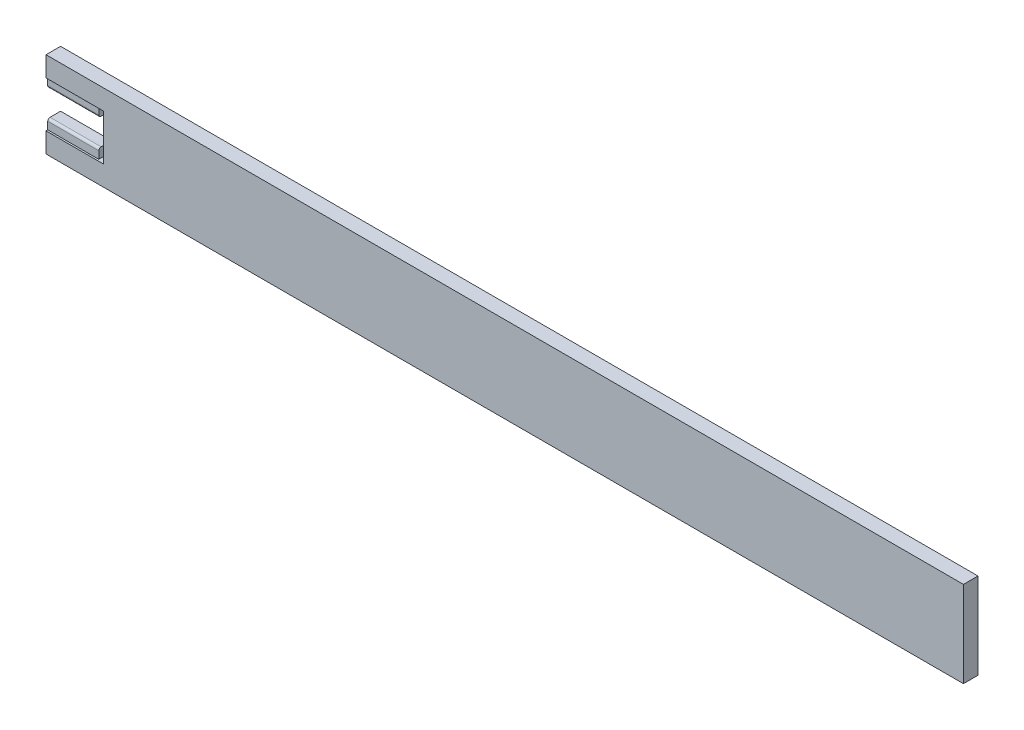
ISO-10303-21;
HEADER;
FILE_DESCRIPTION(('STEP AP214'),'2;1');
FILE_NAME('part.step','',(''),(''),'','','');
FILE_SCHEMA(('AUTOMOTIVE_DESIGN { 1 0 10303 214 1 1 1 1 }'));
ENDSEC;
DATA;
#1=APPLICATION_CONTEXT('core data for automotive mechanical design processes');
#2=APPLICATION_PROTOCOL_DEFINITION('international standard','automotive_design',2000,#1);
#3=PRODUCT_CONTEXT('',#1,'mechanical');
#4=PRODUCT('Part','Part','',(#3));
#5=PRODUCT_RELATED_PRODUCT_CATEGORY('part','',(#4));
#6=PRODUCT_DEFINITION_FORMATION('','',#4);
#7=PRODUCT_DEFINITION_CONTEXT('part definition',#1,'design');
#8=PRODUCT_DEFINITION('design','',#6,#7);
#9=PRODUCT_DEFINITION_SHAPE('','',#8);
#10=(LENGTH_UNIT() NAMED_UNIT(*) SI_UNIT(.MILLI.,.METRE.));
#11=(NAMED_UNIT(*) PLANE_ANGLE_UNIT() SI_UNIT($,.RADIAN.));
#12=(NAMED_UNIT(*) SI_UNIT($,.STERADIAN.) SOLID_ANGLE_UNIT());
#13=UNCERTAINTY_MEASURE_WITH_UNIT(LENGTH_MEASURE(1.E-05),#10,'distance_accuracy_value','');
#14=(GEOMETRIC_REPRESENTATION_CONTEXT(3) GLOBAL_UNCERTAINTY_ASSIGNED_CONTEXT((#13)) GLOBAL_UNIT_ASSIGNED_CONTEXT((#10,
#11,#12)) REPRESENTATION_CONTEXT('',''));
#15=CARTESIAN_POINT('',(0.,0.,0.));
#16=DIRECTION('',(0.,0.,1.));
#17=DIRECTION('',(1.,0.,0.));
#18=AXIS2_PLACEMENT_3D('',#15,#16,#17);
#19=CARTESIAN_POINT('',(0.,98.,0.));
#20=DIRECTION('',(0.,1.,0.));
#21=DIRECTION('',(-1.,0.,0.));
#22=AXIS2_PLACEMENT_3D('',#19,#20,#21);
#23=PLANE('',#22);
#24=DIRECTION('',(0.,0.,1.));
#25=VECTOR('',#24,1.);
#26=CARTESIAN_POINT('',(89.,98.,0.));
#27=LINE('',#26,#25);
#28=CARTESIAN_POINT('',(89.,98.,0.));
#29=VERTEX_POINT('',#28);
#30=CARTESIAN_POINT('',(89.,98.,18.4));
#31=VERTEX_POINT('',#30);
#32=EDGE_CURVE('E239',#29,#31,#27,.T.);
#33=ORIENTED_EDGE('',*,*,#32,.T.);
#34=DIRECTION('',(1.,0.,0.));
#35=VECTOR('',#34,1.);
#36=CARTESIAN_POINT('',(0.,98.,18.4));
#37=LINE('',#36,#35);
#38=CARTESIAN_POINT('',(0.,98.,18.4));
#39=VERTEX_POINT('',#38);
#40=EDGE_CURVE('E50',#31,#39,#37,.F.);
#41=ORIENTED_EDGE('',*,*,#40,.T.);
#42=DIRECTION('',(0.,0.,1.));
#43=VECTOR('',#42,1.);
#44=CARTESIAN_POINT('',(0.,98.,0.));
#45=LINE('',#44,#43);
#46=CARTESIAN_POINT('',(0.,98.,0.));
#47=VERTEX_POINT('',#46);
#48=EDGE_CURVE('E235',#47,#39,#45,.T.);
#49=ORIENTED_EDGE('',*,*,#48,.F.);
#50=DIRECTION('',(-1.,0.,0.));
#51=VECTOR('',#50,1.);
#52=CARTESIAN_POINT('',(0.,98.,0.));
#53=LINE('',#52,#51);
#54=EDGE_CURVE('E222',#29,#47,#53,.T.);
#55=ORIENTED_EDGE('',*,*,#54,.F.);
#56=EDGE_LOOP('',(#33,#41,#49,#55));
#57=FACE_BOUND('',#56,.T.);
#58=ADVANCED_FACE('F41',(#57),#23,.F.);
#59=CARTESIAN_POINT('',(89.,115.,0.));
#60=DIRECTION('',(-1.,0.,0.));
#61=DIRECTION('',(0.,0.,1.));
#62=AXIS2_PLACEMENT_3D('',#59,#60,#61);
#63=PLANE('',#62);
#64=DIRECTION('',(0.,1.,0.));
#65=VECTOR('',#64,1.);
#66=CARTESIAN_POINT('',(89.,115.,22.4));
#67=LINE('',#66,#65);
#68=CARTESIAN_POINT('',(89.,102.,22.4));
#69=VERTEX_POINT('',#68);
#70=CARTESIAN_POINT('',(89.,115.,22.4));
#71=VERTEX_POINT('',#70);
#72=EDGE_CURVE('E193',#69,#71,#67,.T.);
#73=ORIENTED_EDGE('',*,*,#72,.F.);
#74=CARTESIAN_POINT('',(89.,102.,18.4));
#75=DIRECTION('',(-1.,0.,0.));
#76=DIRECTION('',(0.,0.,1.));
#77=AXIS2_PLACEMENT_3D('',#74,#75,#76);
#78=CIRCLE('',#77,4.);
#79=EDGE_CURVE('E64',#69,#31,#78,.F.);
#80=ORIENTED_EDGE('',*,*,#79,.T.);
#81=ORIENTED_EDGE('',*,*,#32,.F.);
#82=DIRECTION('',(0.,-1.,0.));
#83=VECTOR('',#82,1.);
#84=CARTESIAN_POINT('',(89.,115.,0.));
#85=LINE('',#84,#83);
#86=CARTESIAN_POINT('',(89.,115.,0.));
#87=VERTEX_POINT('',#86);
#88=EDGE_CURVE('E218',#87,#29,#85,.T.);
#89=ORIENTED_EDGE('',*,*,#88,.F.);
#90=DIRECTION('',(0.,0.,1.));
#91=VECTOR('',#90,1.);
#92=CARTESIAN_POINT('',(89.,115.,0.));
#93=LINE('',#92,#91);
#94=EDGE_CURVE('E242',#87,#71,#93,.T.);
#95=ORIENTED_EDGE('',*,*,#94,.T.);
#96=EDGE_LOOP('',(#73,#80,#81,#89,#95));
#97=FACE_BOUND('',#96,.T.);
#98=ADVANCED_FACE('F363',(#97),#63,.F.);
#99=CARTESIAN_POINT('',(89.,52.,0.));
#100=DIRECTION('',(-1.,0.,0.));
#101=DIRECTION('',(0.,0.,1.));
#102=AXIS2_PLACEMENT_3D('',#99,#100,#101);
#103=PLANE('',#102);
#104=DIRECTION('',(0.,0.,1.));
#105=VECTOR('',#104,1.);
#106=CARTESIAN_POINT('',(89.,52.,0.));
#107=LINE('',#106,#105);
#108=CARTESIAN_POINT('',(89.,52.,0.));
#109=VERTEX_POINT('',#108);
#110=CARTESIAN_POINT('',(89.,52.,18.4));
#111=VERTEX_POINT('',#110);
#112=EDGE_CURVE('E254',#109,#111,#107,.T.);
#113=ORIENTED_EDGE('',*,*,#112,.T.);
#114=CARTESIAN_POINT('',(89.,48.,18.4));
#115=DIRECTION('',(-1.,0.,0.));
#116=DIRECTION('',(0.,0.,1.));
#117=AXIS2_PLACEMENT_3D('',#114,#115,#116);
#118=CIRCLE('',#117,4.);
#119=CARTESIAN_POINT('',(89.,48.,22.4));
#120=VERTEX_POINT('',#119);
#121=EDGE_CURVE('E311',#111,#120,#118,.F.);
#122=ORIENTED_EDGE('',*,*,#121,.T.);
#123=DIRECTION('',(0.,1.,0.));
#124=VECTOR('',#123,1.);
#125=CARTESIAN_POINT('',(89.,52.,22.4));
#126=LINE('',#125,#124);
#127=CARTESIAN_POINT('',(89.,35.,22.4));
#128=VERTEX_POINT('',#127);
#129=EDGE_CURVE('E187',#128,#120,#126,.T.);
#130=ORIENTED_EDGE('',*,*,#129,.F.);
#131=DIRECTION('',(0.,0.,1.));
#132=VECTOR('',#131,1.);
#133=CARTESIAN_POINT('',(89.,35.,0.));
#134=LINE('',#133,#132);
#135=CARTESIAN_POINT('',(89.,35.,0.));
#136=VERTEX_POINT('',#135);
#137=EDGE_CURVE('E174',#136,#128,#134,.T.);
#138=ORIENTED_EDGE('',*,*,#137,.F.);
#139=DIRECTION('',(0.,-1.,0.));
#140=VECTOR('',#139,1.);
#141=CARTESIAN_POINT('',(89.,52.,0.));
#142=LINE('',#141,#140);
#143=EDGE_CURVE('E201',#109,#136,#142,.T.);
#144=ORIENTED_EDGE('',*,*,#143,.F.);
#145=EDGE_LOOP('',(#113,#122,#130,#138,#144));
#146=FACE_BOUND('',#145,.T.);
#147=ADVANCED_FACE('F345',(#146),#103,.F.);
#148=CARTESIAN_POINT('',(0.,52.,0.));
#149=DIRECTION('',(0.,-1.,0.));
#150=DIRECTION('',(1.,0.,0.));
#151=AXIS2_PLACEMENT_3D('',#148,#149,#150);
#152=PLANE('',#151);
#153=DIRECTION('',(0.,0.,1.));
#154=VECTOR('',#153,1.);
#155=CARTESIAN_POINT('',(0.,52.,0.));
#156=LINE('',#155,#154);
#157=CARTESIAN_POINT('',(0.,52.,0.));
#158=VERTEX_POINT('',#157);
#159=CARTESIAN_POINT('',(0.,52.,18.4));
#160=VERTEX_POINT('',#159);
#161=EDGE_CURVE('E226',#158,#160,#156,.T.);
#162=ORIENTED_EDGE('',*,*,#161,.T.);
#163=DIRECTION('',(-1.,0.,0.));
#164=VECTOR('',#163,1.);
#165=CARTESIAN_POINT('',(89.,52.,18.4));
#166=LINE('',#165,#164);
#167=EDGE_CURVE('E308',#160,#111,#166,.F.);
#168=ORIENTED_EDGE('',*,*,#167,.T.);
#169=ORIENTED_EDGE('',*,*,#112,.F.);
#170=DIRECTION('',(1.,0.,0.));
#171=VECTOR('',#170,1.);
#172=CARTESIAN_POINT('',(0.,52.,0.));
#173=LINE('',#172,#171);
#174=EDGE_CURVE('E197',#158,#109,#173,.T.);
#175=ORIENTED_EDGE('',*,*,#174,.F.);
#176=EDGE_LOOP('',(#162,#168,#169,#175));
#177=FACE_BOUND('',#176,.T.);
#178=ADVANCED_FACE('F348',(#177),#152,.F.);
#179=CARTESIAN_POINT('',(0.,0.,25.4));
#180=DIRECTION('',(1.,0.,0.));
#181=DIRECTION('',(0.,0.,-1.));
#182=AXIS2_PLACEMENT_3D('',#179,#180,#181);
#183=PLANE('',#182);
#184=ORIENTED_EDGE('',*,*,#48,.T.);
#185=CARTESIAN_POINT('',(0.,102.,18.4));
#186=DIRECTION('',(1.,0.,0.));
#187=DIRECTION('',(0.,0.,-1.));
#188=AXIS2_PLACEMENT_3D('',#185,#186,#187);
#189=CIRCLE('',#188,4.);
#190=CARTESIAN_POINT('',(0.,102.,22.4));
#191=VERTEX_POINT('',#190);
#192=EDGE_CURVE('E11',#39,#191,#189,.F.);
#193=ORIENTED_EDGE('',*,*,#192,.T.);
#194=DIRECTION('',(0.,-1.,0.));
#195=VECTOR('',#194,1.);
#196=CARTESIAN_POINT('',(0.,115.,22.4));
#197=LINE('',#196,#195);
#198=CARTESIAN_POINT('',(0.,115.,22.4));
#199=VERTEX_POINT('',#198);
#200=EDGE_CURVE('E164',#199,#191,#197,.T.);
#201=ORIENTED_EDGE('',*,*,#200,.F.);
#202=DIRECTION('',(0.,0.,1.));
#203=VECTOR('',#202,1.);
#204=CARTESIAN_POINT('',(0.,115.,22.4));
#205=LINE('',#204,#203);
#206=CARTESIAN_POINT('',(0.,115.,25.4));
#207=VERTEX_POINT('',#206);
#208=EDGE_CURVE('E182',#199,#207,#205,.T.);
#209=ORIENTED_EDGE('',*,*,#208,.T.);
#210=DIRECTION('',(0.,-1.,0.));
#211=VECTOR('',#210,1.);
#212=CARTESIAN_POINT('',(0.,0.,25.4));
#213=LINE('',#212,#211);
#214=CARTESIAN_POINT('',(0.,150.,25.4));
#215=VERTEX_POINT('',#214);
#216=EDGE_CURVE('E261',#215,#207,#213,.T.);
#217=ORIENTED_EDGE('',*,*,#216,.F.);
#218=DIRECTION('',(0.,0.,-1.));
#219=VECTOR('',#218,1.);
#220=CARTESIAN_POINT('',(0.,150.,25.4));
#221=LINE('',#220,#219);
#222=CARTESIAN_POINT('',(0.,150.,0.));
#223=VERTEX_POINT('',#222);
#224=EDGE_CURVE('E274',#215,#223,#221,.T.);
#225=ORIENTED_EDGE('',*,*,#224,.T.);
#226=DIRECTION('',(0.,-1.,0.));
#227=VECTOR('',#226,1.);
#228=CARTESIAN_POINT('',(0.,0.,0.));
#229=LINE('',#228,#227);
#230=EDGE_CURVE('E275',#223,#47,#229,.T.);
#231=ORIENTED_EDGE('',*,*,#230,.T.);
#232=EDGE_LOOP('',(#184,#193,#201,#209,#217,#225,#231));
#233=FACE_BOUND('',#232,.T.);
#234=ADVANCED_FACE('F382',(#233),#183,.F.);
#235=CARTESIAN_POINT('',(0.,48.,22.4));
#236=VERTEX_POINT('',#235);
#237=CARTESIAN_POINT('',(0.,35.,22.4));
#238=VERTEX_POINT('',#237);
#239=EDGE_CURVE('E153',#236,#238,#197,.T.);
#240=ORIENTED_EDGE('',*,*,#239,.F.);
#241=CARTESIAN_POINT('',(0.,48.,18.4));
#242=DIRECTION('',(1.,0.,0.));
#243=DIRECTION('',(0.,0.,-1.));
#244=AXIS2_PLACEMENT_3D('',#241,#242,#243);
#245=CIRCLE('',#244,4.);
#246=EDGE_CURVE('E305',#236,#160,#245,.F.);
#247=ORIENTED_EDGE('',*,*,#246,.T.);
#248=ORIENTED_EDGE('',*,*,#161,.F.);
#249=CARTESIAN_POINT('',(0.,0.,0.));
#250=VERTEX_POINT('',#249);
#251=EDGE_CURVE('E238',#158,#250,#229,.T.);
#252=ORIENTED_EDGE('',*,*,#251,.T.);
#253=DIRECTION('',(0.,0.,-1.));
#254=VECTOR('',#253,1.);
#255=CARTESIAN_POINT('',(0.,0.,25.4));
#256=LINE('',#255,#254);
#257=CARTESIAN_POINT('',(0.,0.,25.4));
#258=VERTEX_POINT('',#257);
#259=EDGE_CURVE('E299',#258,#250,#256,.T.);
#260=ORIENTED_EDGE('',*,*,#259,.F.);
#261=CARTESIAN_POINT('',(0.,35.,25.4));
#262=VERTEX_POINT('',#261);
#263=EDGE_CURVE('E180',#262,#258,#213,.T.);
#264=ORIENTED_EDGE('',*,*,#263,.F.);
#265=DIRECTION('',(0.,0.,1.));
#266=VECTOR('',#265,1.);
#267=CARTESIAN_POINT('',(0.,35.,22.4));
#268=LINE('',#267,#266);
#269=EDGE_CURVE('E171',#238,#262,#268,.T.);
#270=ORIENTED_EDGE('',*,*,#269,.F.);
#271=EDGE_LOOP('',(#240,#247,#248,#252,#260,#264,#270));
#272=FACE_BOUND('',#271,.T.);
#273=ADVANCED_FACE('F178',(#272),#183,.F.);
#274=CARTESIAN_POINT('',(0.,0.,25.4));
#275=DIRECTION('',(0.,1.,0.));
#276=DIRECTION('',(0.,0.,1.));
#277=AXIS2_PLACEMENT_3D('',#274,#275,#276);
#278=PLANE('',#277);
#279=DIRECTION('',(1.,0.,0.));
#280=VECTOR('',#279,1.);
#281=CARTESIAN_POINT('',(0.,0.,0.));
#282=LINE('',#281,#280);
#283=CARTESIAN_POINT('',(1600.,0.,0.));
#284=VERTEX_POINT('',#283);
#285=EDGE_CURVE('E279',#250,#284,#282,.T.);
#286=ORIENTED_EDGE('',*,*,#285,.T.);
#287=DIRECTION('',(0.,0.,-1.));
#288=VECTOR('',#287,1.);
#289=CARTESIAN_POINT('',(1600.,0.,25.4));
#290=LINE('',#289,#288);
#291=CARTESIAN_POINT('',(1600.,0.,25.4));
#292=VERTEX_POINT('',#291);
#293=EDGE_CURVE('E295',#292,#284,#290,.T.);
#294=ORIENTED_EDGE('',*,*,#293,.F.);
#295=DIRECTION('',(1.,0.,0.));
#296=VECTOR('',#295,1.);
#297=CARTESIAN_POINT('',(0.,0.,25.4));
#298=LINE('',#297,#296);
#299=EDGE_CURVE('E265',#258,#292,#298,.T.);
#300=ORIENTED_EDGE('',*,*,#299,.F.);
#301=ORIENTED_EDGE('',*,*,#259,.T.);
#302=EDGE_LOOP('',(#286,#294,#300,#301));
#303=FACE_BOUND('',#302,.T.);
#304=ADVANCED_FACE('F332',(#303),#278,.F.);
#305=CARTESIAN_POINT('',(1600.,0.,25.4));
#306=DIRECTION('',(-1.,0.,0.));
#307=DIRECTION('',(0.,0.,1.));
#308=AXIS2_PLACEMENT_3D('',#305,#306,#307);
#309=PLANE('',#308);
#310=DIRECTION('',(0.,1.,0.));
#311=VECTOR('',#310,1.);
#312=CARTESIAN_POINT('',(1600.,0.,0.));
#313=LINE('',#312,#311);
#314=CARTESIAN_POINT('',(1600.,150.,0.));
#315=VERTEX_POINT('',#314);
#316=EDGE_CURVE('E282',#284,#315,#313,.T.);
#317=ORIENTED_EDGE('',*,*,#316,.T.);
#318=DIRECTION('',(0.,0.,-1.));
#319=VECTOR('',#318,1.);
#320=CARTESIAN_POINT('',(1600.,150.,25.4));
#321=LINE('',#320,#319);
#322=CARTESIAN_POINT('',(1600.,150.,25.4));
#323=VERTEX_POINT('',#322);
#324=EDGE_CURVE('E291',#323,#315,#321,.T.);
#325=ORIENTED_EDGE('',*,*,#324,.F.);
#326=DIRECTION('',(0.,1.,0.));
#327=VECTOR('',#326,1.);
#328=CARTESIAN_POINT('',(1600.,0.,25.4));
#329=LINE('',#328,#327);
#330=EDGE_CURVE('E268',#292,#323,#329,.T.);
#331=ORIENTED_EDGE('',*,*,#330,.F.);
#332=ORIENTED_EDGE('',*,*,#293,.T.);
#333=EDGE_LOOP('',(#317,#325,#331,#332));
#334=FACE_BOUND('',#333,.T.);
#335=ADVANCED_FACE('F390',(#334),#309,.F.);
#336=CARTESIAN_POINT('',(0.,150.,25.4));
#337=DIRECTION('',(0.,-1.,0.));
#338=DIRECTION('',(0.,0.,-1.));
#339=AXIS2_PLACEMENT_3D('',#336,#337,#338);
#340=PLANE('',#339);
#341=DIRECTION('',(-1.,0.,0.));
#342=VECTOR('',#341,1.);
#343=CARTESIAN_POINT('',(0.,150.,0.));
#344=LINE('',#343,#342);
#345=EDGE_CURVE('E285',#315,#223,#344,.T.);
#346=ORIENTED_EDGE('',*,*,#345,.T.);
#347=ORIENTED_EDGE('',*,*,#224,.F.);
#348=DIRECTION('',(-1.,0.,0.));
#349=VECTOR('',#348,1.);
#350=CARTESIAN_POINT('',(0.,150.,25.4));
#351=LINE('',#350,#349);
#352=EDGE_CURVE('E271',#323,#215,#351,.T.);
#353=ORIENTED_EDGE('',*,*,#352,.F.);
#354=ORIENTED_EDGE('',*,*,#324,.T.);
#355=EDGE_LOOP('',(#346,#347,#353,#354));
#356=FACE_BOUND('',#355,.T.);
#357=ADVANCED_FACE('F385',(#356),#340,.F.);
#358=CARTESIAN_POINT('',(0.,0.,25.4));
#359=DIRECTION('',(0.,0.,-1.));
#360=DIRECTION('',(-1.,0.,0.));
#361=AXIS2_PLACEMENT_3D('',#358,#359,#360);
#362=PLANE('',#361);
#363=ORIENTED_EDGE('',*,*,#216,.T.);
#364=DIRECTION('',(-1.,0.,0.));
#365=VECTOR('',#364,1.);
#366=CARTESIAN_POINT('',(89.,115.,25.4));
#367=LINE('',#366,#365);
#368=CARTESIAN_POINT('',(100.,115.,25.4));
#369=VERTEX_POINT('',#368);
#370=EDGE_CURVE('E202',#369,#207,#367,.T.);
#371=ORIENTED_EDGE('',*,*,#370,.F.);
#372=DIRECTION('',(0.,1.,0.));
#373=VECTOR('',#372,1.);
#374=CARTESIAN_POINT('',(100.,115.,25.4));
#375=LINE('',#374,#373);
#376=CARTESIAN_POINT('',(100.,35.,25.4));
#377=VERTEX_POINT('',#376);
#378=EDGE_CURVE('E229',#377,#369,#375,.T.);
#379=ORIENTED_EDGE('',*,*,#378,.F.);
#380=DIRECTION('',(1.,0.,0.));
#381=VECTOR('',#380,1.);
#382=CARTESIAN_POINT('',(89.,35.,25.4));
#383=LINE('',#382,#381);
#384=EDGE_CURVE('E196',#262,#377,#383,.T.);
#385=ORIENTED_EDGE('',*,*,#384,.F.);
#386=ORIENTED_EDGE('',*,*,#263,.T.);
#387=ORIENTED_EDGE('',*,*,#299,.T.);
#388=ORIENTED_EDGE('',*,*,#330,.T.);
#389=ORIENTED_EDGE('',*,*,#352,.T.);
#390=EDGE_LOOP('',(#363,#371,#379,#385,#386,#387,#388,#389));
#391=FACE_BOUND('',#390,.T.);
#392=ADVANCED_FACE('F335',(#391),#362,.F.);
#393=CARTESIAN_POINT('',(0.,0.,0.));
#394=DIRECTION('',(0.,0.,-1.));
#395=DIRECTION('',(-1.,0.,0.));
#396=AXIS2_PLACEMENT_3D('',#393,#394,#395);
#397=PLANE('',#396);
#398=ORIENTED_EDGE('',*,*,#54,.T.);
#399=ORIENTED_EDGE('',*,*,#230,.F.);
#400=ORIENTED_EDGE('',*,*,#345,.F.);
#401=ORIENTED_EDGE('',*,*,#316,.F.);
#402=ORIENTED_EDGE('',*,*,#285,.F.);
#403=ORIENTED_EDGE('',*,*,#251,.F.);
#404=ORIENTED_EDGE('',*,*,#174,.T.);
#405=ORIENTED_EDGE('',*,*,#143,.T.);
#406=DIRECTION('',(1.,0.,0.));
#407=VECTOR('',#406,1.);
#408=CARTESIAN_POINT('',(89.,35.,0.));
#409=LINE('',#408,#407);
#410=CARTESIAN_POINT('',(100.,35.,0.));
#411=VERTEX_POINT('',#410);
#412=EDGE_CURVE('E206',#136,#411,#409,.T.);
#413=ORIENTED_EDGE('',*,*,#412,.T.);
#414=DIRECTION('',(0.,1.,0.));
#415=VECTOR('',#414,1.);
#416=CARTESIAN_POINT('',(100.,115.,0.));
#417=LINE('',#416,#415);
#418=CARTESIAN_POINT('',(100.,115.,0.));
#419=VERTEX_POINT('',#418);
#420=EDGE_CURVE('E210',#411,#419,#417,.T.);
#421=ORIENTED_EDGE('',*,*,#420,.T.);
#422=DIRECTION('',(-1.,0.,0.));
#423=VECTOR('',#422,1.);
#424=CARTESIAN_POINT('',(89.,115.,0.));
#425=LINE('',#424,#423);
#426=EDGE_CURVE('E214',#419,#87,#425,.T.);
#427=ORIENTED_EDGE('',*,*,#426,.T.);
#428=ORIENTED_EDGE('',*,*,#88,.T.);
#429=EDGE_LOOP('',(#398,#399,#400,#401,#402,#403,#404,#405,#413,#421,#427,#428));
#430=FACE_BOUND('',#429,.T.);
#431=ADVANCED_FACE('F327',(#430),#397,.T.);
#432=CARTESIAN_POINT('',(89.,115.,0.));
#433=DIRECTION('',(0.,1.,0.));
#434=DIRECTION('',(-1.,0.,0.));
#435=AXIS2_PLACEMENT_3D('',#432,#433,#434);
#436=PLANE('',#435);
#437=ORIENTED_EDGE('',*,*,#370,.T.);
#438=ORIENTED_EDGE('',*,*,#208,.F.);
#439=DIRECTION('',(-1.,0.,0.));
#440=VECTOR('',#439,1.);
#441=CARTESIAN_POINT('',(0.,115.,22.4));
#442=LINE('',#441,#440);
#443=EDGE_CURVE('E176',#71,#199,#442,.T.);
#444=ORIENTED_EDGE('',*,*,#443,.F.);
#445=ORIENTED_EDGE('',*,*,#94,.F.);
#446=ORIENTED_EDGE('',*,*,#426,.F.);
#447=DIRECTION('',(0.,0.,1.));
#448=VECTOR('',#447,1.);
#449=CARTESIAN_POINT('',(100.,115.,0.));
#450=LINE('',#449,#448);
#451=EDGE_CURVE('E246',#419,#369,#450,.T.);
#452=ORIENTED_EDGE('',*,*,#451,.T.);
#453=EDGE_LOOP('',(#437,#438,#444,#445,#446,#452));
#454=FACE_BOUND('',#453,.T.);
#455=ADVANCED_FACE('F370',(#454),#436,.F.);
#456=CARTESIAN_POINT('',(100.,115.,0.));
#457=DIRECTION('',(1.,0.,0.));
#458=DIRECTION('',(0.,1.,0.));
#459=AXIS2_PLACEMENT_3D('',#456,#457,#458);
#460=PLANE('',#459);
#461=ORIENTED_EDGE('',*,*,#378,.T.);
#462=ORIENTED_EDGE('',*,*,#451,.F.);
#463=ORIENTED_EDGE('',*,*,#420,.F.);
#464=DIRECTION('',(0.,0.,1.));
#465=VECTOR('',#464,1.);
#466=CARTESIAN_POINT('',(100.,35.,0.));
#467=LINE('',#466,#465);
#468=EDGE_CURVE('E249',#411,#377,#467,.T.);
#469=ORIENTED_EDGE('',*,*,#468,.T.);
#470=EDGE_LOOP('',(#461,#462,#463,#469));
#471=FACE_BOUND('',#470,.T.);
#472=ADVANCED_FACE('F341',(#471),#460,.F.);
#473=CARTESIAN_POINT('',(89.,35.,0.));
#474=DIRECTION('',(0.,-1.,0.));
#475=DIRECTION('',(0.,0.,-1.));
#476=AXIS2_PLACEMENT_3D('',#473,#474,#475);
#477=PLANE('',#476);
#478=ORIENTED_EDGE('',*,*,#384,.T.);
#479=ORIENTED_EDGE('',*,*,#468,.F.);
#480=ORIENTED_EDGE('',*,*,#412,.F.);
#481=ORIENTED_EDGE('',*,*,#137,.T.);
#482=DIRECTION('',(1.,0.,0.));
#483=VECTOR('',#482,1.);
#484=CARTESIAN_POINT('',(0.,35.,22.4));
#485=LINE('',#484,#483);
#486=EDGE_CURVE('E157',#238,#128,#485,.T.);
#487=ORIENTED_EDGE('',*,*,#486,.F.);
#488=ORIENTED_EDGE('',*,*,#269,.T.);
#489=EDGE_LOOP('',(#478,#479,#480,#481,#487,#488));
#490=FACE_BOUND('',#489,.T.);
#491=ADVANCED_FACE('F170',(#490),#477,.F.);
#492=CARTESIAN_POINT('',(0.,0.,22.4));
#493=DIRECTION('',(0.,0.,1.));
#494=DIRECTION('',(1.,0.,0.));
#495=AXIS2_PLACEMENT_3D('',#492,#493,#494);
#496=PLANE('',#495);
#497=ORIENTED_EDGE('',*,*,#129,.T.);
#498=DIRECTION('',(-1.,0.,0.));
#499=VECTOR('',#498,1.);
#500=CARTESIAN_POINT('',(0.,48.,22.4));
#501=LINE('',#500,#499);
#502=EDGE_CURVE('E160',#120,#236,#501,.T.);
#503=ORIENTED_EDGE('',*,*,#502,.T.);
#504=ORIENTED_EDGE('',*,*,#239,.T.);
#505=ORIENTED_EDGE('',*,*,#486,.T.);
#506=EDGE_LOOP('',(#497,#503,#504,#505));
#507=FACE_BOUND('',#506,.T.);
#508=ADVANCED_FACE('F156',(#507),#496,.T.);
#509=ORIENTED_EDGE('',*,*,#200,.T.);
#510=DIRECTION('',(1.,0.,0.));
#511=VECTOR('',#510,1.);
#512=CARTESIAN_POINT('',(89.,102.,22.4));
#513=LINE('',#512,#511);
#514=EDGE_CURVE('E314',#191,#69,#513,.T.);
#515=ORIENTED_EDGE('',*,*,#514,.T.);
#516=ORIENTED_EDGE('',*,*,#72,.T.);
#517=ORIENTED_EDGE('',*,*,#443,.T.);
#518=EDGE_LOOP('',(#509,#515,#516,#517));
#519=FACE_BOUND('',#518,.T.);
#520=ADVANCED_FACE('F353',(#519),#496,.T.);
#521=CARTESIAN_POINT('',(0.,48.,18.4));
#522=DIRECTION('',(1.,0.,0.));
#523=DIRECTION('',(0.,1.,0.));
#524=AXIS2_PLACEMENT_3D('',#521,#522,#523);
#525=CYLINDRICAL_SURFACE('',#524,4.);
#526=ORIENTED_EDGE('',*,*,#121,.F.);
#527=ORIENTED_EDGE('',*,*,#167,.F.);
#528=ORIENTED_EDGE('',*,*,#246,.F.);
#529=ORIENTED_EDGE('',*,*,#502,.F.);
#530=EDGE_LOOP('',(#526,#527,#528,#529));
#531=FACE_BOUND('',#530,.T.);
#532=ADVANCED_FACE('F351',(#531),#525,.T.);
#533=CARTESIAN_POINT('',(0.,102.,18.4));
#534=DIRECTION('',(-1.,0.,0.));
#535=DIRECTION('',(0.,-1.,0.));
#536=AXIS2_PLACEMENT_3D('',#533,#534,#535);
#537=CYLINDRICAL_SURFACE('',#536,4.);
#538=ORIENTED_EDGE('',*,*,#192,.F.);
#539=ORIENTED_EDGE('',*,*,#40,.F.);
#540=ORIENTED_EDGE('',*,*,#79,.F.);
#541=ORIENTED_EDGE('',*,*,#514,.F.);
#542=EDGE_LOOP('',(#538,#539,#540,#541));
#543=FACE_BOUND('',#542,.T.);
#544=ADVANCED_FACE('F43',(#543),#537,.T.);
#545=CLOSED_SHELL('',(#58,#98,#147,#178,#234,#273,#304,#335,#357,#392,#431,#455,#472,#491,#508,
#520,#532,#544));
#546=MANIFOLD_SOLID_BREP('B2',#545);
#547=ADVANCED_BREP_SHAPE_REPRESENTATION('',(#18,#546),#14);
#548=SHAPE_DEFINITION_REPRESENTATION(#9,#547);
ENDSEC;
END-ISO-10303-21;
